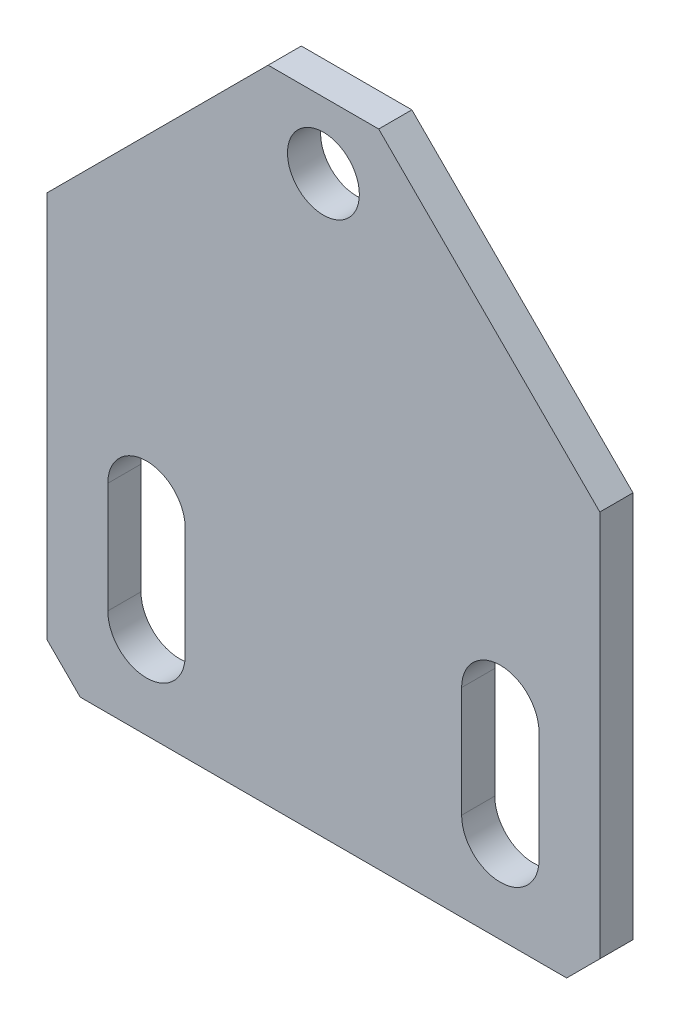
ISO-10303-21;
HEADER;
FILE_DESCRIPTION(('STEP AP214'),'2;1');
FILE_NAME('part.step','',(''),(''),'','','');
FILE_SCHEMA(('AUTOMOTIVE_DESIGN { 1 0 10303 214 1 1 1 1 }'));
ENDSEC;
DATA;
#1=APPLICATION_CONTEXT('core data for automotive mechanical design processes');
#2=APPLICATION_PROTOCOL_DEFINITION('international standard','automotive_design',2000,#1);
#3=PRODUCT_CONTEXT('',#1,'mechanical');
#4=PRODUCT('Part','Part','',(#3));
#5=PRODUCT_RELATED_PRODUCT_CATEGORY('part','',(#4));
#6=PRODUCT_DEFINITION_FORMATION('','',#4);
#7=PRODUCT_DEFINITION_CONTEXT('part definition',#1,'design');
#8=PRODUCT_DEFINITION('design','',#6,#7);
#9=PRODUCT_DEFINITION_SHAPE('','',#8);
#10=(LENGTH_UNIT() NAMED_UNIT(*) SI_UNIT(.MILLI.,.METRE.));
#11=(NAMED_UNIT(*) PLANE_ANGLE_UNIT() SI_UNIT($,.RADIAN.));
#12=(NAMED_UNIT(*) SI_UNIT($,.STERADIAN.) SOLID_ANGLE_UNIT());
#13=UNCERTAINTY_MEASURE_WITH_UNIT(LENGTH_MEASURE(1.E-05),#10,'distance_accuracy_value','');
#14=(GEOMETRIC_REPRESENTATION_CONTEXT(3) GLOBAL_UNCERTAINTY_ASSIGNED_CONTEXT((#13)) GLOBAL_UNIT_ASSIGNED_CONTEXT((#10,
#11,#12)) REPRESENTATION_CONTEXT('',''));
#15=CARTESIAN_POINT('',(0.,0.,0.));
#16=DIRECTION('',(0.,0.,1.));
#17=DIRECTION('',(1.,0.,0.));
#18=AXIS2_PLACEMENT_3D('',#15,#16,#17);
#19=CARTESIAN_POINT('',(-25.,-29.,-3.));
#20=DIRECTION('',(-1.,0.,0.));
#21=DIRECTION('',(0.,0.,1.));
#22=AXIS2_PLACEMENT_3D('',#19,#20,#21);
#23=PLANE('',#22);
#24=DIRECTION('',(0.,0.,1.));
#25=VECTOR('',#24,1.);
#26=CARTESIAN_POINT('',(-25.,9.00000000000001,-10.));
#27=LINE('',#26,#25);
#28=CARTESIAN_POINT('',(-25.,9.00000000000001,-3.));
#29=VERTEX_POINT('',#28);
#30=CARTESIAN_POINT('',(-25.,8.99999999999999,0.));
#31=VERTEX_POINT('',#30);
#32=EDGE_CURVE('E224',#29,#31,#27,.T.);
#33=ORIENTED_EDGE('',*,*,#32,.F.);
#34=DIRECTION('',(0.,-1.,0.));
#35=VECTOR('',#34,1.);
#36=CARTESIAN_POINT('',(-25.,-29.,-3.));
#37=LINE('',#36,#35);
#38=CARTESIAN_POINT('',(-25.,-26.,-3.));
#39=VERTEX_POINT('',#38);
#40=EDGE_CURVE('E248',#29,#39,#37,.T.);
#41=ORIENTED_EDGE('',*,*,#40,.T.);
#42=DIRECTION('',(0.,0.,1.));
#43=VECTOR('',#42,1.);
#44=CARTESIAN_POINT('',(-25.,-26.,-3.));
#45=LINE('',#44,#43);
#46=CARTESIAN_POINT('',(-25.,-26.,0.));
#47=VERTEX_POINT('',#46);
#48=EDGE_CURVE('E260',#39,#47,#45,.T.);
#49=ORIENTED_EDGE('',*,*,#48,.T.);
#50=DIRECTION('',(0.,-1.,0.));
#51=VECTOR('',#50,1.);
#52=CARTESIAN_POINT('',(-25.,-29.,0.));
#53=LINE('',#52,#51);
#54=EDGE_CURVE('E247',#31,#47,#53,.T.);
#55=ORIENTED_EDGE('',*,*,#54,.F.);
#56=EDGE_LOOP('',(#33,#41,#49,#55));
#57=FACE_BOUND('',#56,.T.);
#58=ADVANCED_FACE('F39',(#57),#23,.T.);
#59=CARTESIAN_POINT('',(25.,29.,-3.));
#60=DIRECTION('',(0.,1.,0.));
#61=DIRECTION('',(-1.,0.,0.));
#62=AXIS2_PLACEMENT_3D('',#59,#60,#61);
#63=PLANE('',#62);
#64=DIRECTION('',(0.,0.,1.));
#65=VECTOR('',#64,1.);
#66=CARTESIAN_POINT('',(-5.,29.,-10.));
#67=LINE('',#66,#65);
#68=CARTESIAN_POINT('',(-5.,29.,-3.));
#69=VERTEX_POINT('',#68);
#70=CARTESIAN_POINT('',(-5.,29.,0.));
#71=VERTEX_POINT('',#70);
#72=EDGE_CURVE('E226',#69,#71,#67,.T.);
#73=ORIENTED_EDGE('',*,*,#72,.T.);
#74=DIRECTION('',(-1.,0.,0.));
#75=VECTOR('',#74,1.);
#76=CARTESIAN_POINT('',(25.,29.,0.));
#77=LINE('',#76,#75);
#78=CARTESIAN_POINT('',(5.,29.,0.));
#79=VERTEX_POINT('',#78);
#80=EDGE_CURVE('E251',#79,#71,#77,.T.);
#81=ORIENTED_EDGE('',*,*,#80,.F.);
#82=DIRECTION('',(0.,0.,1.));
#83=VECTOR('',#82,1.);
#84=CARTESIAN_POINT('',(5.,29.,-10.));
#85=LINE('',#84,#83);
#86=CARTESIAN_POINT('',(5.,29.,-3.));
#87=VERTEX_POINT('',#86);
#88=EDGE_CURVE('E232',#87,#79,#85,.T.);
#89=ORIENTED_EDGE('',*,*,#88,.F.);
#90=DIRECTION('',(-1.,0.,0.));
#91=VECTOR('',#90,1.);
#92=CARTESIAN_POINT('',(25.,29.,-3.));
#93=LINE('',#92,#91);
#94=EDGE_CURVE('E257',#87,#69,#93,.T.);
#95=ORIENTED_EDGE('',*,*,#94,.T.);
#96=EDGE_LOOP('',(#73,#81,#89,#95));
#97=FACE_BOUND('',#96,.T.);
#98=ADVANCED_FACE('F305',(#97),#63,.T.);
#99=CARTESIAN_POINT('',(25.,-29.,-3.));
#100=DIRECTION('',(1.,0.,0.));
#101=DIRECTION('',(0.,0.,-1.));
#102=AXIS2_PLACEMENT_3D('',#99,#100,#101);
#103=PLANE('',#102);
#104=DIRECTION('',(0.,0.,1.));
#105=VECTOR('',#104,1.);
#106=CARTESIAN_POINT('',(25.,9.00000000000001,-10.));
#107=LINE('',#106,#105);
#108=CARTESIAN_POINT('',(25.,9.00000000000001,-3.));
#109=VERTEX_POINT('',#108);
#110=CARTESIAN_POINT('',(25.,9.00000000000001,0.));
#111=VERTEX_POINT('',#110);
#112=EDGE_CURVE('E225',#109,#111,#107,.T.);
#113=ORIENTED_EDGE('',*,*,#112,.T.);
#114=DIRECTION('',(0.,1.,0.));
#115=VECTOR('',#114,1.);
#116=CARTESIAN_POINT('',(25.,-29.,0.));
#117=LINE('',#116,#115);
#118=CARTESIAN_POINT('',(25.,-26.,0.));
#119=VERTEX_POINT('',#118);
#120=EDGE_CURVE('E265',#119,#111,#117,.T.);
#121=ORIENTED_EDGE('',*,*,#120,.F.);
#122=DIRECTION('',(0.,0.,-1.));
#123=VECTOR('',#122,1.);
#124=CARTESIAN_POINT('',(25.,-26.,-3.));
#125=LINE('',#124,#123);
#126=CARTESIAN_POINT('',(25.,-26.,-3.));
#127=VERTEX_POINT('',#126);
#128=EDGE_CURVE('E11',#119,#127,#125,.T.);
#129=ORIENTED_EDGE('',*,*,#128,.T.);
#130=DIRECTION('',(0.,1.,0.));
#131=VECTOR('',#130,1.);
#132=CARTESIAN_POINT('',(25.,-29.,-3.));
#133=LINE('',#132,#131);
#134=EDGE_CURVE('E254',#127,#109,#133,.T.);
#135=ORIENTED_EDGE('',*,*,#134,.T.);
#136=EDGE_LOOP('',(#113,#121,#129,#135));
#137=FACE_BOUND('',#136,.T.);
#138=ADVANCED_FACE('F311',(#137),#103,.T.);
#139=CARTESIAN_POINT('',(25.,-29.,-3.));
#140=DIRECTION('',(0.,-1.,0.));
#141=DIRECTION('',(1.,0.,0.));
#142=AXIS2_PLACEMENT_3D('',#139,#140,#141);
#143=PLANE('',#142);
#144=DIRECTION('',(1.,0.,0.));
#145=VECTOR('',#144,1.);
#146=CARTESIAN_POINT('',(25.,-29.,0.));
#147=LINE('',#146,#145);
#148=CARTESIAN_POINT('',(-22.,-29.,0.));
#149=VERTEX_POINT('',#148);
#150=CARTESIAN_POINT('',(22.,-29.,0.));
#151=VERTEX_POINT('',#150);
#152=EDGE_CURVE('E262',#149,#151,#147,.T.);
#153=ORIENTED_EDGE('',*,*,#152,.F.);
#154=DIRECTION('',(0.,0.,-1.));
#155=VECTOR('',#154,1.);
#156=CARTESIAN_POINT('',(-22.,-29.,-3.));
#157=LINE('',#156,#155);
#158=CARTESIAN_POINT('',(-22.,-29.,-3.));
#159=VERTEX_POINT('',#158);
#160=EDGE_CURVE('E279',#149,#159,#157,.T.);
#161=ORIENTED_EDGE('',*,*,#160,.T.);
#162=DIRECTION('',(1.,0.,0.));
#163=VECTOR('',#162,1.);
#164=CARTESIAN_POINT('',(25.,-29.,-3.));
#165=LINE('',#164,#163);
#166=CARTESIAN_POINT('',(22.,-29.,-3.));
#167=VERTEX_POINT('',#166);
#168=EDGE_CURVE('E250',#159,#167,#165,.T.);
#169=ORIENTED_EDGE('',*,*,#168,.T.);
#170=DIRECTION('',(0.,0.,1.));
#171=VECTOR('',#170,1.);
#172=CARTESIAN_POINT('',(22.,-29.,-3.));
#173=LINE('',#172,#171);
#174=EDGE_CURVE('E276',#167,#151,#173,.T.);
#175=ORIENTED_EDGE('',*,*,#174,.T.);
#176=EDGE_LOOP('',(#153,#161,#169,#175));
#177=FACE_BOUND('',#176,.T.);
#178=ADVANCED_FACE('F318',(#177),#143,.T.);
#179=CARTESIAN_POINT('',(0.,0.,-3.));
#180=DIRECTION('',(0.,0.,1.));
#181=DIRECTION('',(1.,0.,0.));
#182=AXIS2_PLACEMENT_3D('',#179,#180,#181);
#183=PLANE('',#182);
#184=DIRECTION('',(0.,-1.,0.));
#185=VECTOR('',#184,1.);
#186=CARTESIAN_POINT('',(-19.5,0.,-3.));
#187=LINE('',#186,#185);
#188=CARTESIAN_POINT('',(-19.5,-11.,-3.));
#189=VERTEX_POINT('',#188);
#190=CARTESIAN_POINT('',(-19.5,-21.,-3.));
#191=VERTEX_POINT('',#190);
#192=EDGE_CURVE('E208',#189,#191,#187,.T.);
#193=ORIENTED_EDGE('',*,*,#192,.T.);
#194=CARTESIAN_POINT('',(-16.,-21.,-3.));
#195=DIRECTION('',(0.,0.,1.));
#196=DIRECTION('',(1.,0.,0.));
#197=AXIS2_PLACEMENT_3D('',#194,#195,#196);
#198=CIRCLE('',#197,3.5);
#199=CARTESIAN_POINT('',(-12.5,-21.,-3.));
#200=VERTEX_POINT('',#199);
#201=EDGE_CURVE('E219',#191,#200,#198,.T.);
#202=ORIENTED_EDGE('',*,*,#201,.T.);
#203=DIRECTION('',(0.,1.,0.));
#204=VECTOR('',#203,1.);
#205=CARTESIAN_POINT('',(-12.5,0.,-3.));
#206=LINE('',#205,#204);
#207=CARTESIAN_POINT('',(-12.5,-11.,-3.));
#208=VERTEX_POINT('',#207);
#209=EDGE_CURVE('E55',#200,#208,#206,.T.);
#210=ORIENTED_EDGE('',*,*,#209,.T.);
#211=CARTESIAN_POINT('',(-16.,-11.,-3.));
#212=DIRECTION('',(0.,0.,1.));
#213=DIRECTION('',(1.,0.,0.));
#214=AXIS2_PLACEMENT_3D('',#211,#212,#213);
#215=CIRCLE('',#214,3.5);
#216=EDGE_CURVE('E217',#208,#189,#215,.T.);
#217=ORIENTED_EDGE('',*,*,#216,.T.);
#218=EDGE_LOOP('',(#193,#202,#210,#217));
#219=FACE_BOUND('',#218,.T.);
#220=DIRECTION('',(0.,-1.,0.));
#221=VECTOR('',#220,1.);
#222=CARTESIAN_POINT('',(12.5,0.,-3.));
#223=LINE('',#222,#221);
#224=CARTESIAN_POINT('',(12.5,-11.,-3.));
#225=VERTEX_POINT('',#224);
#226=CARTESIAN_POINT('',(12.5,-21.,-3.));
#227=VERTEX_POINT('',#226);
#228=EDGE_CURVE('E211',#225,#227,#223,.T.);
#229=ORIENTED_EDGE('',*,*,#228,.T.);
#230=CARTESIAN_POINT('',(16.,-21.,-3.));
#231=DIRECTION('',(0.,0.,1.));
#232=DIRECTION('',(1.,0.,0.));
#233=AXIS2_PLACEMENT_3D('',#230,#231,#232);
#234=CIRCLE('',#233,3.5);
#235=CARTESIAN_POINT('',(19.5,-21.,-3.));
#236=VERTEX_POINT('',#235);
#237=EDGE_CURVE('E215',#227,#236,#234,.T.);
#238=ORIENTED_EDGE('',*,*,#237,.T.);
#239=DIRECTION('',(0.,1.,0.));
#240=VECTOR('',#239,1.);
#241=CARTESIAN_POINT('',(19.5,0.,-3.));
#242=LINE('',#241,#240);
#243=CARTESIAN_POINT('',(19.5,-11.,-3.));
#244=VERTEX_POINT('',#243);
#245=EDGE_CURVE('E63',#236,#244,#242,.T.);
#246=ORIENTED_EDGE('',*,*,#245,.T.);
#247=CARTESIAN_POINT('',(16.,-11.,-3.));
#248=DIRECTION('',(0.,0.,1.));
#249=DIRECTION('',(1.,0.,0.));
#250=AXIS2_PLACEMENT_3D('',#247,#248,#249);
#251=CIRCLE('',#250,3.5);
#252=EDGE_CURVE('E213',#244,#225,#251,.T.);
#253=ORIENTED_EDGE('',*,*,#252,.T.);
#254=EDGE_LOOP('',(#229,#238,#246,#253));
#255=FACE_BOUND('',#254,.T.);
#256=CARTESIAN_POINT('',(0.,23.,-3.));
#257=DIRECTION('',(0.,0.,1.));
#258=DIRECTION('',(1.,0.,0.));
#259=AXIS2_PLACEMENT_3D('',#256,#257,#258);
#260=CIRCLE('',#259,3.25);
#261=CARTESIAN_POINT('',(3.25,23.,-3.));
#262=VERTEX_POINT('',#261);
#263=EDGE_CURVE('E244',#262,#262,#260,.T.);
#264=ORIENTED_EDGE('',*,*,#263,.T.);
#265=EDGE_LOOP('',(#264));
#266=FACE_BOUND('',#265,.T.);
#267=ORIENTED_EDGE('',*,*,#40,.F.);
#268=DIRECTION('',(0.707106781186547,0.707106781186548,0.));
#269=VECTOR('',#268,1.);
#270=CARTESIAN_POINT('',(-17.,17.,-3.));
#271=LINE('',#270,#269);
#272=EDGE_CURVE('E238',#29,#69,#271,.T.);
#273=ORIENTED_EDGE('',*,*,#272,.T.);
#274=ORIENTED_EDGE('',*,*,#94,.F.);
#275=DIRECTION('',(0.707106781186547,-0.707106781186548,0.));
#276=VECTOR('',#275,1.);
#277=CARTESIAN_POINT('',(17.,17.,-3.));
#278=LINE('',#277,#276);
#279=EDGE_CURVE('E229',#87,#109,#278,.T.);
#280=ORIENTED_EDGE('',*,*,#279,.T.);
#281=ORIENTED_EDGE('',*,*,#134,.F.);
#282=DIRECTION('',(0.707106781186546,0.707106781186549,0.));
#283=VECTOR('',#282,1.);
#284=CARTESIAN_POINT('',(22.,-29.,-3.));
#285=LINE('',#284,#283);
#286=EDGE_CURVE('E281',#127,#167,#285,.F.);
#287=ORIENTED_EDGE('',*,*,#286,.T.);
#288=ORIENTED_EDGE('',*,*,#168,.F.);
#289=DIRECTION('',(0.707106781186548,-0.707106781186547,0.));
#290=VECTOR('',#289,1.);
#291=CARTESIAN_POINT('',(-25.,-26.,-3.));
#292=LINE('',#291,#290);
#293=EDGE_CURVE('E48',#159,#39,#292,.F.);
#294=ORIENTED_EDGE('',*,*,#293,.T.);
#295=EDGE_LOOP('',(#267,#273,#274,#280,#281,#287,#288,#294));
#296=FACE_BOUND('',#295,.T.);
#297=ADVANCED_FACE('F288',(#219,#255,#266,#296),#183,.F.);
#298=CARTESIAN_POINT('',(0.,0.,0.));
#299=DIRECTION('',(0.,0.,1.));
#300=DIRECTION('',(1.,0.,0.));
#301=AXIS2_PLACEMENT_3D('',#298,#299,#300);
#302=PLANE('',#301);
#303=DIRECTION('',(0.,-1.,0.));
#304=VECTOR('',#303,1.);
#305=CARTESIAN_POINT('',(-19.5,-21.,0.));
#306=LINE('',#305,#304);
#307=CARTESIAN_POINT('',(-19.5,-11.,0.));
#308=VERTEX_POINT('',#307);
#309=CARTESIAN_POINT('',(-19.5,-21.,0.));
#310=VERTEX_POINT('',#309);
#311=EDGE_CURVE('E162',#308,#310,#306,.T.);
#312=ORIENTED_EDGE('',*,*,#311,.F.);
#313=CARTESIAN_POINT('',(-16.,-11.,0.));
#314=DIRECTION('',(0.,0.,1.));
#315=DIRECTION('',(1.,0.,0.));
#316=AXIS2_PLACEMENT_3D('',#313,#314,#315);
#317=CIRCLE('',#316,3.5);
#318=CARTESIAN_POINT('',(-12.5,-11.,0.));
#319=VERTEX_POINT('',#318);
#320=EDGE_CURVE('E177',#319,#308,#317,.T.);
#321=ORIENTED_EDGE('',*,*,#320,.F.);
#322=DIRECTION('',(0.,1.,0.));
#323=VECTOR('',#322,1.);
#324=CARTESIAN_POINT('',(-12.5,-21.,0.));
#325=LINE('',#324,#323);
#326=CARTESIAN_POINT('',(-12.5,-21.,0.));
#327=VERTEX_POINT('',#326);
#328=EDGE_CURVE('E157',#327,#319,#325,.T.);
#329=ORIENTED_EDGE('',*,*,#328,.F.);
#330=CARTESIAN_POINT('',(-16.,-21.,0.));
#331=DIRECTION('',(0.,0.,1.));
#332=DIRECTION('',(1.,0.,0.));
#333=AXIS2_PLACEMENT_3D('',#330,#331,#332);
#334=CIRCLE('',#333,3.5);
#335=EDGE_CURVE('E165',#310,#327,#334,.T.);
#336=ORIENTED_EDGE('',*,*,#335,.F.);
#337=EDGE_LOOP('',(#312,#321,#329,#336));
#338=FACE_BOUND('',#337,.T.);
#339=DIRECTION('',(0.,-1.,0.));
#340=VECTOR('',#339,1.);
#341=CARTESIAN_POINT('',(12.5,-21.,0.));
#342=LINE('',#341,#340);
#343=CARTESIAN_POINT('',(12.5,-11.,0.));
#344=VERTEX_POINT('',#343);
#345=CARTESIAN_POINT('',(12.5,-21.,0.));
#346=VERTEX_POINT('',#345);
#347=EDGE_CURVE('E195',#344,#346,#342,.T.);
#348=ORIENTED_EDGE('',*,*,#347,.F.);
#349=CARTESIAN_POINT('',(16.,-11.,0.));
#350=DIRECTION('',(0.,0.,1.));
#351=DIRECTION('',(1.,0.,0.));
#352=AXIS2_PLACEMENT_3D('',#349,#350,#351);
#353=CIRCLE('',#352,3.5);
#354=CARTESIAN_POINT('',(19.5,-11.,0.));
#355=VERTEX_POINT('',#354);
#356=EDGE_CURVE('E192',#355,#344,#353,.T.);
#357=ORIENTED_EDGE('',*,*,#356,.F.);
#358=DIRECTION('',(0.,1.,0.));
#359=VECTOR('',#358,1.);
#360=CARTESIAN_POINT('',(19.5,-21.,0.));
#361=LINE('',#360,#359);
#362=CARTESIAN_POINT('',(19.5,-21.,0.));
#363=VERTEX_POINT('',#362);
#364=EDGE_CURVE('E190',#363,#355,#361,.T.);
#365=ORIENTED_EDGE('',*,*,#364,.F.);
#366=CARTESIAN_POINT('',(16.,-21.,0.));
#367=DIRECTION('',(0.,0.,1.));
#368=DIRECTION('',(1.,0.,0.));
#369=AXIS2_PLACEMENT_3D('',#366,#367,#368);
#370=CIRCLE('',#369,3.5);
#371=EDGE_CURVE('E187',#346,#363,#370,.T.);
#372=ORIENTED_EDGE('',*,*,#371,.F.);
#373=EDGE_LOOP('',(#348,#357,#365,#372));
#374=FACE_BOUND('',#373,.T.);
#375=DIRECTION('',(0.707106781186547,0.707106781186548,0.));
#376=VECTOR('',#375,1.);
#377=CARTESIAN_POINT('',(-5.,29.,0.));
#378=LINE('',#377,#376);
#379=EDGE_CURVE('E222',#31,#71,#378,.T.);
#380=ORIENTED_EDGE('',*,*,#379,.F.);
#381=ORIENTED_EDGE('',*,*,#54,.T.);
#382=DIRECTION('',(-0.707106781186548,0.707106781186547,0.));
#383=VECTOR('',#382,1.);
#384=CARTESIAN_POINT('',(-25.5,-25.5,0.));
#385=LINE('',#384,#383);
#386=EDGE_CURVE('E274',#47,#149,#385,.F.);
#387=ORIENTED_EDGE('',*,*,#386,.T.);
#388=ORIENTED_EDGE('',*,*,#152,.T.);
#389=DIRECTION('',(-0.707106781186546,-0.707106781186549,0.));
#390=VECTOR('',#389,1.);
#391=CARTESIAN_POINT('',(25.5,-25.4999999999999,0.));
#392=LINE('',#391,#390);
#393=EDGE_CURVE('E272',#151,#119,#392,.F.);
#394=ORIENTED_EDGE('',*,*,#393,.T.);
#395=ORIENTED_EDGE('',*,*,#120,.T.);
#396=DIRECTION('',(0.707106781186547,-0.707106781186548,0.));
#397=VECTOR('',#396,1.);
#398=CARTESIAN_POINT('',(5.,29.,0.));
#399=LINE('',#398,#397);
#400=EDGE_CURVE('E221',#79,#111,#399,.T.);
#401=ORIENTED_EDGE('',*,*,#400,.F.);
#402=ORIENTED_EDGE('',*,*,#80,.T.);
#403=EDGE_LOOP('',(#380,#381,#387,#388,#394,#395,#401,#402));
#404=FACE_BOUND('',#403,.T.);
#405=CARTESIAN_POINT('',(0.,23.,0.));
#406=DIRECTION('',(0.,0.,1.));
#407=DIRECTION('',(1.,0.,0.));
#408=AXIS2_PLACEMENT_3D('',#405,#406,#407);
#409=CIRCLE('',#408,3.25);
#410=CARTESIAN_POINT('',(3.25,23.,0.));
#411=VERTEX_POINT('',#410);
#412=EDGE_CURVE('E241',#411,#411,#409,.T.);
#413=ORIENTED_EDGE('',*,*,#412,.F.);
#414=EDGE_LOOP('',(#413));
#415=FACE_BOUND('',#414,.T.);
#416=ADVANCED_FACE('F174',(#338,#374,#404,#415),#302,.T.);
#417=CARTESIAN_POINT('',(0.,23.,-10.));
#418=DIRECTION('',(0.,0.,1.));
#419=DIRECTION('',(1.,0.,0.));
#420=AXIS2_PLACEMENT_3D('',#417,#418,#419);
#421=CYLINDRICAL_SURFACE('',#420,3.25);
#422=ORIENTED_EDGE('',*,*,#412,.T.);
#423=EDGE_LOOP('',(#422));
#424=FACE_BOUND('',#423,.T.);
#425=ORIENTED_EDGE('',*,*,#263,.F.);
#426=EDGE_LOOP('',(#425));
#427=FACE_BOUND('',#426,.T.);
#428=ADVANCED_FACE('F337',(#424,#427),#421,.F.);
#429=CARTESIAN_POINT('',(-25.,-26.,-3.));
#430=DIRECTION('',(0.707106781186547,0.707106781186548,0.));
#431=DIRECTION('',(0.,0.,1.));
#432=AXIS2_PLACEMENT_3D('',#429,#430,#431);
#433=PLANE('',#432);
#434=ORIENTED_EDGE('',*,*,#293,.F.);
#435=ORIENTED_EDGE('',*,*,#160,.F.);
#436=ORIENTED_EDGE('',*,*,#386,.F.);
#437=ORIENTED_EDGE('',*,*,#48,.F.);
#438=EDGE_LOOP('',(#434,#435,#436,#437));
#439=FACE_BOUND('',#438,.T.);
#440=ADVANCED_FACE('F292',(#439),#433,.F.);
#441=CARTESIAN_POINT('',(22.,-29.,-3.));
#442=DIRECTION('',(-0.707106781186549,0.707106781186546,0.));
#443=DIRECTION('',(0.,0.,1.));
#444=AXIS2_PLACEMENT_3D('',#441,#442,#443);
#445=PLANE('',#444);
#446=ORIENTED_EDGE('',*,*,#286,.F.);
#447=ORIENTED_EDGE('',*,*,#128,.F.);
#448=ORIENTED_EDGE('',*,*,#393,.F.);
#449=ORIENTED_EDGE('',*,*,#174,.F.);
#450=EDGE_LOOP('',(#446,#447,#448,#449));
#451=FACE_BOUND('',#450,.T.);
#452=ADVANCED_FACE('F42',(#451),#445,.F.);
#453=CARTESIAN_POINT('',(5.,29.,-10.));
#454=DIRECTION('',(-0.707106781186548,-0.707106781186547,0.));
#455=DIRECTION('',(0.707106781186547,-0.707106781186548,0.));
#456=AXIS2_PLACEMENT_3D('',#453,#454,#455);
#457=PLANE('',#456);
#458=ORIENTED_EDGE('',*,*,#88,.T.);
#459=ORIENTED_EDGE('',*,*,#400,.T.);
#460=ORIENTED_EDGE('',*,*,#112,.F.);
#461=ORIENTED_EDGE('',*,*,#279,.F.);
#462=EDGE_LOOP('',(#458,#459,#460,#461));
#463=FACE_BOUND('',#462,.T.);
#464=ADVANCED_FACE('F342',(#463),#457,.F.);
#465=CARTESIAN_POINT('',(-5.,29.,-10.));
#466=DIRECTION('',(0.707106781186548,-0.707106781186547,0.));
#467=DIRECTION('',(0.707106781186547,0.707106781186548,0.));
#468=AXIS2_PLACEMENT_3D('',#465,#466,#467);
#469=PLANE('',#468);
#470=ORIENTED_EDGE('',*,*,#32,.T.);
#471=ORIENTED_EDGE('',*,*,#379,.T.);
#472=ORIENTED_EDGE('',*,*,#72,.F.);
#473=ORIENTED_EDGE('',*,*,#272,.F.);
#474=EDGE_LOOP('',(#470,#471,#472,#473));
#475=FACE_BOUND('',#474,.T.);
#476=ADVANCED_FACE('F298',(#475),#469,.F.);
#477=CARTESIAN_POINT('',(16.,-21.,-10.));
#478=DIRECTION('',(0.,0.,1.));
#479=DIRECTION('',(1.,0.,0.));
#480=AXIS2_PLACEMENT_3D('',#477,#478,#479);
#481=CYLINDRICAL_SURFACE('',#480,3.5);
#482=DIRECTION('',(0.,0.,1.));
#483=VECTOR('',#482,1.);
#484=CARTESIAN_POINT('',(12.5,-21.,-10.));
#485=LINE('',#484,#483);
#486=EDGE_CURVE('E171',#227,#346,#485,.T.);
#487=ORIENTED_EDGE('',*,*,#486,.T.);
#488=ORIENTED_EDGE('',*,*,#371,.T.);
#489=DIRECTION('',(0.,0.,1.));
#490=VECTOR('',#489,1.);
#491=CARTESIAN_POINT('',(19.5,-21.,-10.));
#492=LINE('',#491,#490);
#493=EDGE_CURVE('E198',#236,#363,#492,.T.);
#494=ORIENTED_EDGE('',*,*,#493,.F.);
#495=ORIENTED_EDGE('',*,*,#237,.F.);
#496=EDGE_LOOP('',(#487,#488,#494,#495));
#497=FACE_BOUND('',#496,.T.);
#498=ADVANCED_FACE('F355',(#497),#481,.F.);
#499=CARTESIAN_POINT('',(16.,-11.,-10.));
#500=DIRECTION('',(0.,0.,1.));
#501=DIRECTION('',(1.,0.,0.));
#502=AXIS2_PLACEMENT_3D('',#499,#500,#501);
#503=CYLINDRICAL_SURFACE('',#502,3.5);
#504=DIRECTION('',(0.,0.,1.));
#505=VECTOR('',#504,1.);
#506=CARTESIAN_POINT('',(19.5,-11.,-10.));
#507=LINE('',#506,#505);
#508=EDGE_CURVE('E203',#244,#355,#507,.T.);
#509=ORIENTED_EDGE('',*,*,#508,.T.);
#510=ORIENTED_EDGE('',*,*,#356,.T.);
#511=DIRECTION('',(0.,0.,1.));
#512=VECTOR('',#511,1.);
#513=CARTESIAN_POINT('',(12.5,-11.,-10.));
#514=LINE('',#513,#512);
#515=EDGE_CURVE('E200',#225,#344,#514,.T.);
#516=ORIENTED_EDGE('',*,*,#515,.F.);
#517=ORIENTED_EDGE('',*,*,#252,.F.);
#518=EDGE_LOOP('',(#509,#510,#516,#517));
#519=FACE_BOUND('',#518,.T.);
#520=ADVANCED_FACE('F358',(#519),#503,.F.);
#521=CARTESIAN_POINT('',(12.5,-21.,-10.));
#522=DIRECTION('',(-1.,0.,0.));
#523=DIRECTION('',(0.,-1.,0.));
#524=AXIS2_PLACEMENT_3D('',#521,#522,#523);
#525=PLANE('',#524);
#526=ORIENTED_EDGE('',*,*,#515,.T.);
#527=ORIENTED_EDGE('',*,*,#347,.T.);
#528=ORIENTED_EDGE('',*,*,#486,.F.);
#529=ORIENTED_EDGE('',*,*,#228,.F.);
#530=EDGE_LOOP('',(#526,#527,#528,#529));
#531=FACE_BOUND('',#530,.T.);
#532=ADVANCED_FACE('F363',(#531),#525,.F.);
#533=CARTESIAN_POINT('',(19.5,-21.,-10.));
#534=DIRECTION('',(1.,0.,0.));
#535=DIRECTION('',(0.,1.,0.));
#536=AXIS2_PLACEMENT_3D('',#533,#534,#535);
#537=PLANE('',#536);
#538=ORIENTED_EDGE('',*,*,#493,.T.);
#539=ORIENTED_EDGE('',*,*,#364,.T.);
#540=ORIENTED_EDGE('',*,*,#508,.F.);
#541=ORIENTED_EDGE('',*,*,#245,.F.);
#542=EDGE_LOOP('',(#538,#539,#540,#541));
#543=FACE_BOUND('',#542,.T.);
#544=ADVANCED_FACE('F360',(#543),#537,.F.);
#545=CARTESIAN_POINT('',(-16.,-21.,-10.));
#546=DIRECTION('',(0.,0.,1.));
#547=DIRECTION('',(1.,0.,0.));
#548=AXIS2_PLACEMENT_3D('',#545,#546,#547);
#549=CYLINDRICAL_SURFACE('',#548,3.5);
#550=DIRECTION('',(0.,0.,1.));
#551=VECTOR('',#550,1.);
#552=CARTESIAN_POINT('',(-19.5,-21.,-10.));
#553=LINE('',#552,#551);
#554=EDGE_CURVE('E168',#191,#310,#553,.T.);
#555=ORIENTED_EDGE('',*,*,#554,.T.);
#556=ORIENTED_EDGE('',*,*,#335,.T.);
#557=DIRECTION('',(0.,0.,1.));
#558=VECTOR('',#557,1.);
#559=CARTESIAN_POINT('',(-12.5,-21.,-10.));
#560=LINE('',#559,#558);
#561=EDGE_CURVE('E153',#200,#327,#560,.T.);
#562=ORIENTED_EDGE('',*,*,#561,.F.);
#563=ORIENTED_EDGE('',*,*,#201,.F.);
#564=EDGE_LOOP('',(#555,#556,#562,#563));
#565=FACE_BOUND('',#564,.T.);
#566=ADVANCED_FACE('F166',(#565),#549,.F.);
#567=CARTESIAN_POINT('',(-16.,-11.,-10.));
#568=DIRECTION('',(0.,0.,1.));
#569=DIRECTION('',(1.,0.,0.));
#570=AXIS2_PLACEMENT_3D('',#567,#568,#569);
#571=CYLINDRICAL_SURFACE('',#570,3.5);
#572=DIRECTION('',(0.,0.,1.));
#573=VECTOR('',#572,1.);
#574=CARTESIAN_POINT('',(-12.5,-11.,-10.));
#575=LINE('',#574,#573);
#576=EDGE_CURVE('E161',#208,#319,#575,.T.);
#577=ORIENTED_EDGE('',*,*,#576,.T.);
#578=ORIENTED_EDGE('',*,*,#320,.T.);
#579=DIRECTION('',(0.,0.,1.));
#580=VECTOR('',#579,1.);
#581=CARTESIAN_POINT('',(-19.5,-11.,-10.));
#582=LINE('',#581,#580);
#583=EDGE_CURVE('E183',#189,#308,#582,.T.);
#584=ORIENTED_EDGE('',*,*,#583,.F.);
#585=ORIENTED_EDGE('',*,*,#216,.F.);
#586=EDGE_LOOP('',(#577,#578,#584,#585));
#587=FACE_BOUND('',#586,.T.);
#588=ADVANCED_FACE('F373',(#587),#571,.F.);
#589=CARTESIAN_POINT('',(-19.5,-21.,-10.));
#590=DIRECTION('',(-1.,0.,0.));
#591=DIRECTION('',(0.,-1.,0.));
#592=AXIS2_PLACEMENT_3D('',#589,#590,#591);
#593=PLANE('',#592);
#594=ORIENTED_EDGE('',*,*,#583,.T.);
#595=ORIENTED_EDGE('',*,*,#311,.T.);
#596=ORIENTED_EDGE('',*,*,#554,.F.);
#597=ORIENTED_EDGE('',*,*,#192,.F.);
#598=EDGE_LOOP('',(#594,#595,#596,#597));
#599=FACE_BOUND('',#598,.T.);
#600=ADVANCED_FACE('F376',(#599),#593,.F.);
#601=CARTESIAN_POINT('',(-12.5,-21.,-10.));
#602=DIRECTION('',(1.,0.,0.));
#603=DIRECTION('',(0.,1.,0.));
#604=AXIS2_PLACEMENT_3D('',#601,#602,#603);
#605=PLANE('',#604);
#606=ORIENTED_EDGE('',*,*,#561,.T.);
#607=ORIENTED_EDGE('',*,*,#328,.T.);
#608=ORIENTED_EDGE('',*,*,#576,.F.);
#609=ORIENTED_EDGE('',*,*,#209,.F.);
#610=EDGE_LOOP('',(#606,#607,#608,#609));
#611=FACE_BOUND('',#610,.T.);
#612=ADVANCED_FACE('F155',(#611),#605,.F.);
#613=CLOSED_SHELL('',(#58,#98,#138,#178,#297,#416,#428,#440,#452,#464,#476,#498,#520,#532,#544,
#566,#588,#600,#612));
#614=MANIFOLD_SOLID_BREP('B2',#613);
#615=ADVANCED_BREP_SHAPE_REPRESENTATION('',(#18,#614),#14);
#616=SHAPE_DEFINITION_REPRESENTATION(#9,#615);
ENDSEC;
END-ISO-10303-21;
